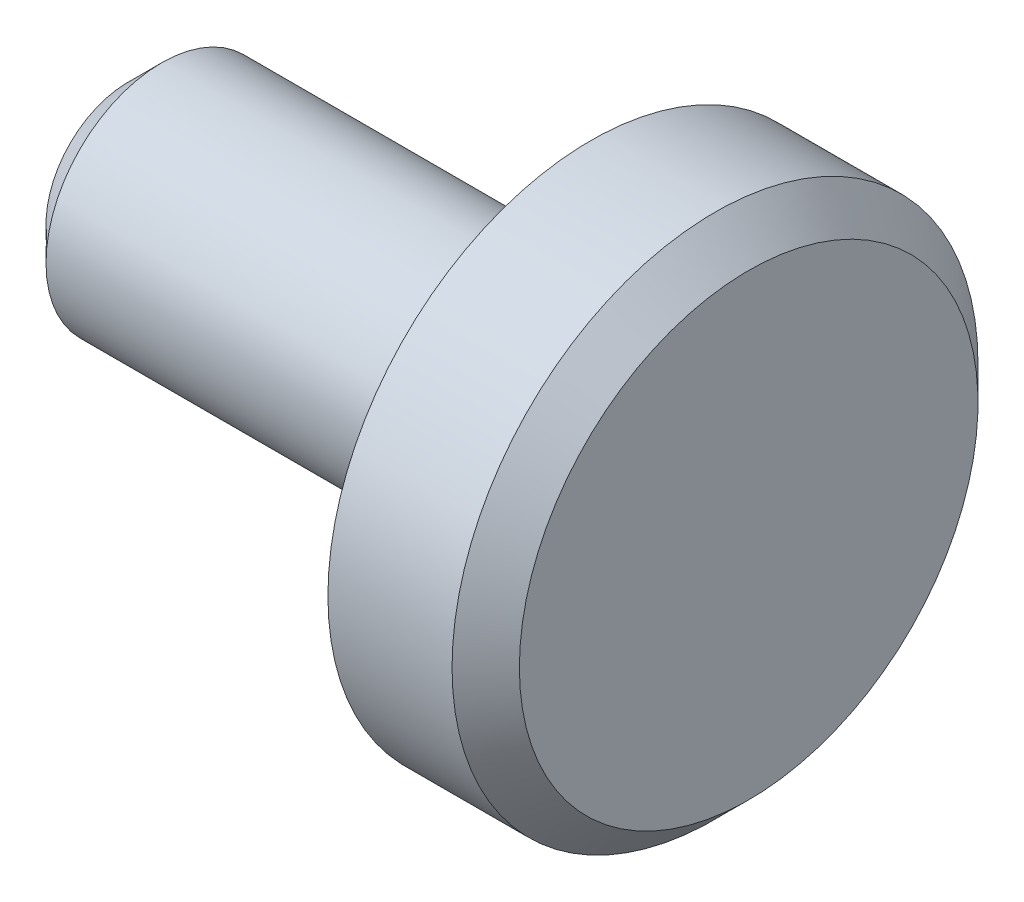
ISO-10303-21;
HEADER;
FILE_DESCRIPTION(('STEP AP214'),'2;1');
FILE_NAME('part.step','',(''),(''),'','','');
FILE_SCHEMA(('AUTOMOTIVE_DESIGN { 1 0 10303 214 1 1 1 1 }'));
ENDSEC;
DATA;
#1=APPLICATION_CONTEXT('core data for automotive mechanical design processes');
#2=APPLICATION_PROTOCOL_DEFINITION('international standard','automotive_design',2000,#1);
#3=PRODUCT_CONTEXT('',#1,'mechanical');
#4=PRODUCT('Part','Part','',(#3));
#5=PRODUCT_RELATED_PRODUCT_CATEGORY('part','',(#4));
#6=PRODUCT_DEFINITION_FORMATION('','',#4);
#7=PRODUCT_DEFINITION_CONTEXT('part definition',#1,'design');
#8=PRODUCT_DEFINITION('design','',#6,#7);
#9=PRODUCT_DEFINITION_SHAPE('','',#8);
#10=(LENGTH_UNIT() NAMED_UNIT(*) SI_UNIT(.MILLI.,.METRE.));
#11=(NAMED_UNIT(*) PLANE_ANGLE_UNIT() SI_UNIT($,.RADIAN.));
#12=(NAMED_UNIT(*) SI_UNIT($,.STERADIAN.) SOLID_ANGLE_UNIT());
#13=UNCERTAINTY_MEASURE_WITH_UNIT(LENGTH_MEASURE(1.E-05),#10,'distance_accuracy_value','');
#14=(GEOMETRIC_REPRESENTATION_CONTEXT(3) GLOBAL_UNCERTAINTY_ASSIGNED_CONTEXT((#13)) GLOBAL_UNIT_ASSIGNED_CONTEXT((#10,
#11,#12)) REPRESENTATION_CONTEXT('',''));
#15=CARTESIAN_POINT('',(0.,0.,0.));
#16=DIRECTION('',(0.,0.,1.));
#17=DIRECTION('',(1.,0.,0.));
#18=AXIS2_PLACEMENT_3D('',#15,#16,#17);
#19=CARTESIAN_POINT('',(0.,0.,0.));
#20=DIRECTION('',(-1.,0.,0.));
#21=DIRECTION('',(0.,0.,1.));
#22=AXIS2_PLACEMENT_3D('',#19,#20,#21);
#23=PLANE('',#22);
#24=CARTESIAN_POINT('',(0.,0.,0.));
#25=DIRECTION('',(-1.,0.,0.));
#26=DIRECTION('',(0.,0.,1.));
#27=AXIS2_PLACEMENT_3D('',#24,#25,#26);
#28=CIRCLE('',#27,5.53719999999999);
#29=CARTESIAN_POINT('',(0.,0.,5.53719999999999));
#30=VERTEX_POINT('',#29);
#31=EDGE_CURVE('E53',#30,#30,#28,.F.);
#32=ORIENTED_EDGE('',*,*,#31,.T.);
#33=EDGE_LOOP('',(#32));
#34=FACE_BOUND('',#33,.T.);
#35=ADVANCED_FACE('F42',(#34),#23,.F.);
#36=CARTESIAN_POINT('',(-14.986,0.,0.));
#37=DIRECTION('',(-1.,0.,0.));
#38=DIRECTION('',(0.,0.,1.));
#39=AXIS2_PLACEMENT_3D('',#36,#37,#38);
#40=CYLINDRICAL_SURFACE('',#39,6.35);
#41=CARTESIAN_POINT('',(-0.812800000000004,0.,0.));
#42=DIRECTION('',(-1.,0.,0.));
#43=DIRECTION('',(0.,0.,1.));
#44=AXIS2_PLACEMENT_3D('',#41,#42,#43);
#45=CIRCLE('',#44,6.35);
#46=CARTESIAN_POINT('',(-0.812800000000004,0.,6.35));
#47=VERTEX_POINT('',#46);
#48=EDGE_CURVE('E57',#47,#47,#45,.T.);
#49=ORIENTED_EDGE('',*,*,#48,.T.);
#50=EDGE_LOOP('',(#49));
#51=FACE_BOUND('',#50,.T.);
#52=CARTESIAN_POINT('',(-3.81,0.,0.));
#53=DIRECTION('',(-1.,0.,0.));
#54=DIRECTION('',(0.,0.,1.));
#55=AXIS2_PLACEMENT_3D('',#52,#53,#54);
#56=CIRCLE('',#55,6.35);
#57=CARTESIAN_POINT('',(-3.81,0.,6.35));
#58=VERTEX_POINT('',#57);
#59=EDGE_CURVE('E62',#58,#58,#56,.T.);
#60=ORIENTED_EDGE('',*,*,#59,.F.);
#61=EDGE_LOOP('',(#60));
#62=FACE_BOUND('',#61,.T.);
#63=ADVANCED_FACE('F74',(#51,#62),#40,.T.);
#64=CARTESIAN_POINT('',(-3.81,6.35,0.));
#65=DIRECTION('',(1.,0.,0.));
#66=DIRECTION('',(0.,0.,-1.));
#67=AXIS2_PLACEMENT_3D('',#64,#65,#66);
#68=PLANE('',#67);
#69=CARTESIAN_POINT('',(-3.81,0.,0.));
#70=DIRECTION('',(-1.,0.,0.));
#71=DIRECTION('',(0.,0.,1.));
#72=AXIS2_PLACEMENT_3D('',#69,#70,#71);
#73=CIRCLE('',#72,2.794);
#74=CARTESIAN_POINT('',(-3.81,0.,2.794));
#75=VERTEX_POINT('',#74);
#76=EDGE_CURVE('E65',#75,#75,#73,.T.);
#77=ORIENTED_EDGE('',*,*,#76,.F.);
#78=EDGE_LOOP('',(#77));
#79=FACE_BOUND('',#78,.T.);
#80=ORIENTED_EDGE('',*,*,#59,.T.);
#81=EDGE_LOOP('',(#80));
#82=FACE_BOUND('',#81,.T.);
#83=ADVANCED_FACE('F71',(#79,#82),#68,.F.);
#84=CARTESIAN_POINT('',(-14.986,0.,0.));
#85=DIRECTION('',(-1.,0.,0.));
#86=DIRECTION('',(0.,0.,1.));
#87=AXIS2_PLACEMENT_3D('',#84,#85,#86);
#88=CYLINDRICAL_SURFACE('',#87,2.794);
#89=CARTESIAN_POINT('',(-14.1732,0.,0.));
#90=DIRECTION('',(1.,0.,0.));
#91=DIRECTION('',(0.,0.,-1.));
#92=AXIS2_PLACEMENT_3D('',#89,#90,#91);
#93=CIRCLE('',#92,2.794);
#94=CARTESIAN_POINT('',(-14.1732,0.,-2.794));
#95=VERTEX_POINT('',#94);
#96=EDGE_CURVE('E12',#95,#95,#93,.T.);
#97=ORIENTED_EDGE('',*,*,#96,.T.);
#98=EDGE_LOOP('',(#97));
#99=FACE_BOUND('',#98,.T.);
#100=ORIENTED_EDGE('',*,*,#76,.T.);
#101=EDGE_LOOP('',(#100));
#102=FACE_BOUND('',#101,.T.);
#103=ADVANCED_FACE('F69',(#99,#102),#88,.T.);
#104=CARTESIAN_POINT('',(-14.986,2.794,0.));
#105=DIRECTION('',(1.,0.,0.));
#106=DIRECTION('',(0.,0.,-1.));
#107=AXIS2_PLACEMENT_3D('',#104,#105,#106);
#108=PLANE('',#107);
#109=CARTESIAN_POINT('',(-14.986,0.,0.));
#110=DIRECTION('',(1.,0.,0.));
#111=DIRECTION('',(0.,0.,-1.));
#112=AXIS2_PLACEMENT_3D('',#109,#110,#111);
#113=CIRCLE('',#112,1.9812);
#114=CARTESIAN_POINT('',(-14.986,0.,-1.9812));
#115=VERTEX_POINT('',#114);
#116=EDGE_CURVE('E49',#115,#115,#113,.F.);
#117=ORIENTED_EDGE('',*,*,#116,.T.);
#118=EDGE_LOOP('',(#117));
#119=FACE_BOUND('',#118,.T.);
#120=ADVANCED_FACE('F89',(#119),#108,.F.);
#121=CARTESIAN_POINT('',(-0.812800000000004,0.,0.));
#122=DIRECTION('',(-1.,0.,0.));
#123=DIRECTION('',(0.,0.,1.));
#124=AXIS2_PLACEMENT_3D('',#121,#122,#123);
#125=CONICAL_SURFACE('',#124,6.35,0.785398163397449);
#126=ORIENTED_EDGE('',*,*,#31,.F.);
#127=EDGE_LOOP('',(#126));
#128=FACE_BOUND('',#127,.T.);
#129=ORIENTED_EDGE('',*,*,#48,.F.);
#130=EDGE_LOOP('',(#129));
#131=FACE_BOUND('',#130,.T.);
#132=ADVANCED_FACE('F87',(#128,#131),#125,.T.);
#133=CARTESIAN_POINT('',(-14.986,0.,0.));
#134=DIRECTION('',(1.,0.,0.));
#135=DIRECTION('',(0.,0.,-1.));
#136=AXIS2_PLACEMENT_3D('',#133,#134,#135);
#137=CONICAL_SURFACE('',#136,1.9812,0.785398163397444);
#138=ORIENTED_EDGE('',*,*,#96,.F.);
#139=EDGE_LOOP('',(#138));
#140=FACE_BOUND('',#139,.T.);
#141=ORIENTED_EDGE('',*,*,#116,.F.);
#142=EDGE_LOOP('',(#141));
#143=FACE_BOUND('',#142,.T.);
#144=ADVANCED_FACE('F44',(#140,#143),#137,.T.);
#145=CLOSED_SHELL('',(#35,#63,#83,#103,#120,#132,#144));
#146=MANIFOLD_SOLID_BREP('B2',#145);
#147=ADVANCED_BREP_SHAPE_REPRESENTATION('',(#18,#146),#14);
#148=SHAPE_DEFINITION_REPRESENTATION(#9,#147);
ENDSEC;
END-ISO-10303-21;
